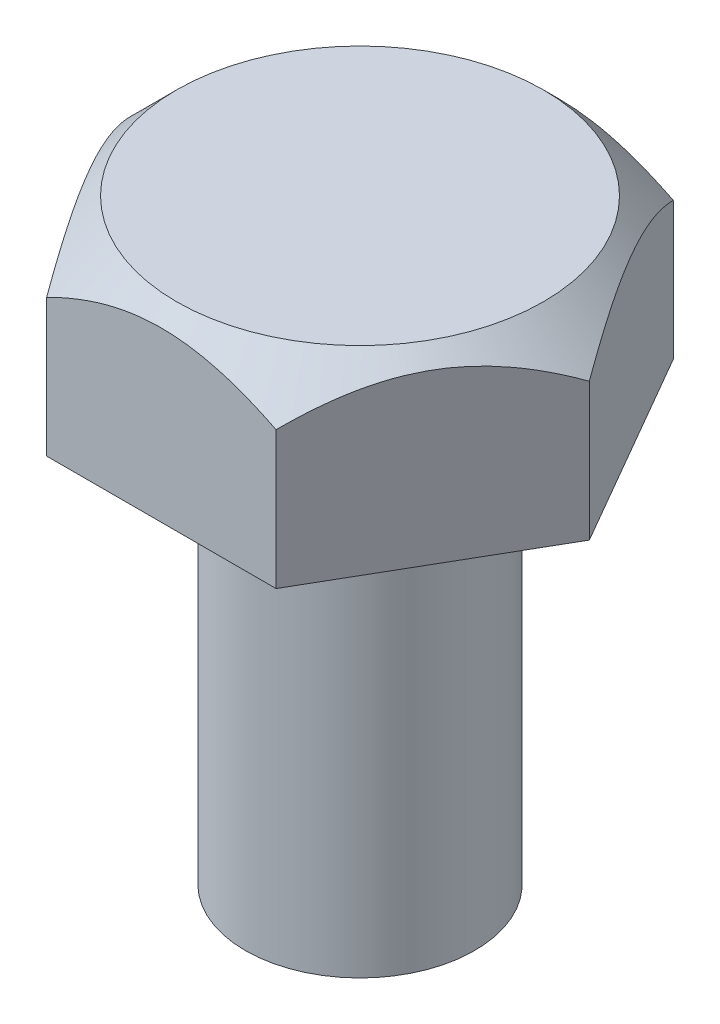
ISO-10303-21;
HEADER;
FILE_DESCRIPTION(('STEP AP214'),'2;1');
FILE_NAME('part.step','',(''),(''),'','','');
FILE_SCHEMA(('AUTOMOTIVE_DESIGN { 1 0 10303 214 1 1 1 1 }'));
ENDSEC;
DATA;
#1=APPLICATION_CONTEXT('core data for automotive mechanical design processes');
#2=APPLICATION_PROTOCOL_DEFINITION('international standard','automotive_design',2000,#1);
#3=PRODUCT_CONTEXT('',#1,'mechanical');
#4=PRODUCT('Part','Part','',(#3));
#5=PRODUCT_RELATED_PRODUCT_CATEGORY('part','',(#4));
#6=PRODUCT_DEFINITION_FORMATION('','',#4);
#7=PRODUCT_DEFINITION_CONTEXT('part definition',#1,'design');
#8=PRODUCT_DEFINITION('design','',#6,#7);
#9=PRODUCT_DEFINITION_SHAPE('','',#8);
#10=(LENGTH_UNIT() NAMED_UNIT(*) SI_UNIT(.MILLI.,.METRE.));
#11=(NAMED_UNIT(*) PLANE_ANGLE_UNIT() SI_UNIT($,.RADIAN.));
#12=(NAMED_UNIT(*) SI_UNIT($,.STERADIAN.) SOLID_ANGLE_UNIT());
#13=UNCERTAINTY_MEASURE_WITH_UNIT(LENGTH_MEASURE(1.E-05),#10,'distance_accuracy_value','');
#14=(GEOMETRIC_REPRESENTATION_CONTEXT(3) GLOBAL_UNCERTAINTY_ASSIGNED_CONTEXT((#13)) GLOBAL_UNIT_ASSIGNED_CONTEXT((#10,
#11,#12)) REPRESENTATION_CONTEXT('',''));
#15=CARTESIAN_POINT('',(0.,0.,0.));
#16=DIRECTION('',(0.,0.,1.));
#17=DIRECTION('',(1.,0.,0.));
#18=AXIS2_PLACEMENT_3D('',#15,#16,#17);
#19=CARTESIAN_POINT('',(0.,9.,0.));
#20=DIRECTION('',(0.,-1.,0.));
#21=DIRECTION('',(0.,0.,-1.));
#22=AXIS2_PLACEMENT_3D('',#19,#20,#21);
#23=CYLINDRICAL_SURFACE('',#22,2.5);
#24=CARTESIAN_POINT('',(0.,9.,0.));
#25=DIRECTION('',(0.,1.,0.));
#26=DIRECTION('',(0.,0.,1.));
#27=AXIS2_PLACEMENT_3D('',#24,#25,#26);
#28=CIRCLE('',#27,2.5);
#29=CARTESIAN_POINT('',(0.,9.,2.5));
#30=VERTEX_POINT('',#29);
#31=EDGE_CURVE('E11',#30,#30,#28,.T.);
#32=ORIENTED_EDGE('',*,*,#31,.F.);
#33=EDGE_LOOP('',(#32));
#34=FACE_BOUND('',#33,.T.);
#35=CARTESIAN_POINT('',(0.,0.,0.));
#36=DIRECTION('',(0.,1.,0.));
#37=DIRECTION('',(0.,0.,1.));
#38=AXIS2_PLACEMENT_3D('',#35,#36,#37);
#39=CIRCLE('',#38,2.5);
#40=CARTESIAN_POINT('',(0.,0.,2.5));
#41=VERTEX_POINT('',#40);
#42=EDGE_CURVE('E45',#41,#41,#39,.T.);
#43=ORIENTED_EDGE('',*,*,#42,.T.);
#44=EDGE_LOOP('',(#43));
#45=FACE_BOUND('',#44,.T.);
#46=ADVANCED_FACE('F39',(#34,#45),#23,.T.);
#47=CARTESIAN_POINT('',(0.,0.,0.));
#48=DIRECTION('',(0.,1.,0.));
#49=DIRECTION('',(0.,0.,1.));
#50=AXIS2_PLACEMENT_3D('',#47,#48,#49);
#51=PLANE('',#50);
#52=ORIENTED_EDGE('',*,*,#42,.F.);
#53=EDGE_LOOP('',(#52));
#54=FACE_BOUND('',#53,.T.);
#55=ADVANCED_FACE('F128',(#54),#51,.F.);
#56=CARTESIAN_POINT('',(-5.,13.,0.));
#57=DIRECTION('',(0.866025403784439,0.,-0.5));
#58=DIRECTION('',(-0.5,0.,-0.866025403784439));
#59=AXIS2_PLACEMENT_3D('',#56,#57,#58);
#60=PLANE('',#59);
#61=DIRECTION('',(0.,-1.,0.));
#62=VECTOR('',#61,1.);
#63=CARTESIAN_POINT('',(-2.5,13.,4.33012701892219));
#64=LINE('',#63,#62);
#65=CARTESIAN_POINT('',(-2.5,12.,4.33012701892219));
#66=VERTEX_POINT('',#65);
#67=CARTESIAN_POINT('',(-2.5,9.,4.33012701892219));
#68=VERTEX_POINT('',#67);
#69=EDGE_CURVE('E118',#66,#68,#64,.T.);
#70=ORIENTED_EDGE('',*,*,#69,.F.);
#71=CARTESIAN_POINT('',(-2.49988452994616,11.9998845259463,4.33032701892219));
#72=CARTESIAN_POINT('',(-2.54287138041576,12.0428679014172,4.25587160985149));
#73=CARTESIAN_POINT('',(-2.58618865330985,12.0845322160249,4.18084389235359));
#74=CARTESIAN_POINT('',(-2.67354887274435,12.1648214570814,4.02953155373268));
#75=CARTESIAN_POINT('',(-2.71759219997896,12.2034447234691,3.95324627322795));
#76=CARTESIAN_POINT('',(-2.85131771209198,12.3144804420678,3.72162689198003));
#77=CARTESIAN_POINT('',(-2.94213197757914,12.3815850955109,3.56433197010422));
#78=CARTESIAN_POINT('',(-3.12526622915858,12.4964973477853,3.24713414176253));
#79=CARTESIAN_POINT('',(-3.21753940303059,12.5445944631137,3.08731231644057));
#80=CARTESIAN_POINT('',(-3.35746623690526,12.6002311247179,2.8449519308274));
#81=CARTESIAN_POINT('',(-3.40431453249364,12.616017735568,2.76380830262032));
#82=CARTESIAN_POINT('',(-3.4984078137364,12.6417307019677,2.60083395885699));
#83=CARTESIAN_POINT('',(-3.54565273902892,12.6516579334098,2.51900334785054));
#84=CARTESIAN_POINT('',(-3.66078037944806,12.6683021731439,2.31959642528907));
#85=CARTESIAN_POINT('',(-3.72878713668329,12.6717946588034,2.20180526649966));
#86=CARTESIAN_POINT('',(-3.86467809794897,12.6659341038672,1.96643521729813));
#87=CARTESIAN_POINT('',(-3.93256225066694,12.6565765602643,1.84885641576183));
#88=CARTESIAN_POINT('',(-4.06769057590285,12.6255675384182,1.61480729091154));
#89=CARTESIAN_POINT('',(-4.13493394699394,12.6039023105296,1.49833835570958));
#90=CARTESIAN_POINT('',(-4.26826494691756,12.5494557859257,1.26740228961789));
#91=CARTESIAN_POINT('',(-4.33435266395686,12.516675341522,1.1529350059496));
#92=CARTESIAN_POINT('',(-4.45167355371377,12.4492338613143,0.949729264101439));
#93=CARTESIAN_POINT('',(-4.5031664451357,12.4163460937711,0.860540959930036));
#94=CARTESIAN_POINT('',(-4.60522781060437,12.3452704801556,0.683765489448429));
#95=CARTESIAN_POINT('',(-4.65579625649568,12.3070824729595,0.596178371904883));
#96=CARTESIAN_POINT('',(-4.75584946376349,12.226262498628,0.422881133456828));
#97=CARTESIAN_POINT('',(-4.80533707077893,12.1836445061233,0.337166083761075));
#98=CARTESIAN_POINT('',(-4.90339584958638,12.0945241637333,0.16732329673841));
#99=CARTESIAN_POINT('',(-4.95196756146993,12.048024196775,0.0831946239455099));
#100=CARTESIAN_POINT('',(-5.00011547005384,11.9998845259463,-0.000199999999998267));
#101=B_SPLINE_CURVE_WITH_KNOTS('',3,(#71,#72,#73,#74,#75,#76,#77,#78,#79,#80,#81,#82,#83,#84,
#85,#86,#87,#88,#89,#90,#91,#92,#93,#94,#95,#96,#97,#98,#99,#100),.UNSPECIFIED.,.F.,.F.,(4,2,2,
2,2,2,2,2,2,2,2,2,2,2,4),(0.,0.288343025050063,0.576842376266667,1.15695604992332,
1.72785747296512,2.01274823950903,2.29759640821263,2.70513724110404,3.11282092407139,
3.52096095288677,3.92906969271704,4.25324617843569,4.57743252106522,4.90062556888121,
5.22362166510138),.UNSPECIFIED.);
#102=CARTESIAN_POINT('',(-5.,12.,0.));
#103=VERTEX_POINT('',#102);
#104=EDGE_CURVE('E148',#66,#103,#101,.T.);
#105=ORIENTED_EDGE('',*,*,#104,.T.);
#106=DIRECTION('',(0.,-1.,0.));
#107=VECTOR('',#106,1.);
#108=CARTESIAN_POINT('',(-5.,13.,0.));
#109=LINE('',#108,#107);
#110=CARTESIAN_POINT('',(-5.,9.,0.));
#111=VERTEX_POINT('',#110);
#112=EDGE_CURVE('E62',#103,#111,#109,.T.);
#113=ORIENTED_EDGE('',*,*,#112,.T.);
#114=DIRECTION('',(0.5,0.,0.866025403784439));
#115=VECTOR('',#114,1.);
#116=CARTESIAN_POINT('',(-5.,9.,0.));
#117=LINE('',#116,#115);
#118=EDGE_CURVE('E152',#111,#68,#117,.T.);
#119=ORIENTED_EDGE('',*,*,#118,.T.);
#120=EDGE_LOOP('',(#70,#105,#113,#119));
#121=FACE_BOUND('',#120,.T.);
#122=ADVANCED_FACE('F135',(#121),#60,.F.);
#123=CARTESIAN_POINT('',(-2.5,13.,4.33012701892219));
#124=DIRECTION('',(0.,0.,-1.));
#125=DIRECTION('',(-1.,0.,0.));
#126=AXIS2_PLACEMENT_3D('',#123,#124,#125);
#127=PLANE('',#126);
#128=DIRECTION('',(0.,-1.,0.));
#129=VECTOR('',#128,1.);
#130=CARTESIAN_POINT('',(2.5,13.,4.33012701892219));
#131=LINE('',#130,#129);
#132=CARTESIAN_POINT('',(2.5,12.,4.33012701892219));
#133=VERTEX_POINT('',#132);
#134=CARTESIAN_POINT('',(2.5,9.,4.33012701892219));
#135=VERTEX_POINT('',#134);
#136=EDGE_CURVE('E111',#133,#135,#131,.T.);
#137=ORIENTED_EDGE('',*,*,#136,.F.);
#138=CARTESIAN_POINT('',(7.59921951359279,8.25367864666697,4.3301270189222));
#139=CARTESIAN_POINT('',(7.48699247756582,8.35118426563294,4.3301270189222));
#140=CARTESIAN_POINT('',(7.37450605913897,8.44839137505781,4.3301270189222));
#141=CARTESIAN_POINT('',(7.14894544849833,8.64212478615553,4.3301270189222));
#142=CARTESIAN_POINT('',(7.03587124679441,8.73865107677647,4.3301270189222));
#143=CARTESIAN_POINT('',(6.69556519020094,9.02716624616905,4.3301270189222));
#144=CARTESIAN_POINT('',(6.46735241242823,9.21800207958195,4.3301270189222));
#145=CARTESIAN_POINT('',(6.00244910758804,9.59990517797512,4.3301270189222));
#146=CARTESIAN_POINT('',(5.76568333547581,9.79088117220917,4.3301270189222));
#147=CARTESIAN_POINT('',(5.28773027314545,10.1671121203224,4.3301270189222));
#148=CARTESIAN_POINT('',(5.04654410187623,10.3523684910034,4.33012701892219));
#149=CARTESIAN_POINT('',(4.55795427576486,10.7152539731287,4.33012701892219));
#150=CARTESIAN_POINT('',(4.31054304061882,10.8928729934364,4.33012701892219));
#151=CARTESIAN_POINT('',(3.93341818828449,11.1507750381669,4.33012701892219));
#152=CARTESIAN_POINT('',(3.80664733518685,11.2353592003148,4.33012701892219));
#153=CARTESIAN_POINT('',(3.55082533863258,11.4009968353064,4.33012701892219));
#154=CARTESIAN_POINT('',(3.42177439311459,11.4820506125323,4.33012701892219));
#155=CARTESIAN_POINT('',(3.16199806432158,11.639251894182,4.33012701892219));
#156=CARTESIAN_POINT('',(3.03129190461664,11.7154310235148,4.33012701892219));
#157=CARTESIAN_POINT('',(2.7669085874914,11.8625188449221,4.33012701892219));
#158=CARTESIAN_POINT('',(2.63323107423656,11.9334269012938,4.33012701892219));
#159=CARTESIAN_POINT('',(2.36276633080915,12.0685737969327,4.33012701892219));
#160=CARTESIAN_POINT('',(2.22598396638433,12.1328222970525,4.33012701892219));
#161=CARTESIAN_POINT('',(1.94889793365953,12.2531442688083,4.33012701892219));
#162=CARTESIAN_POINT('',(1.80859565104085,12.3092209000482,4.33012701892219));
#163=CARTESIAN_POINT('',(1.5210910162557,12.4124815838396,4.33012701892219));
#164=CARTESIAN_POINT('',(1.37380428933833,12.459434008593,4.33012701892219));
#165=CARTESIAN_POINT('',(1.07571750853243,12.5405572677146,4.33012701892219));
#166=CARTESIAN_POINT('',(0.924918018453904,12.5747301384307,4.33012701892219));
#167=CARTESIAN_POINT('',(0.621622317866135,12.6280097359017,4.33012701892219));
#168=CARTESIAN_POINT('',(0.469143126259013,12.6472114182584,4.33012701892219));
#169=CARTESIAN_POINT('',(0.16300220939947,12.6694938314688,4.33012701892219));
#170=CARTESIAN_POINT('',(0.00934062284925808,12.6725764251674,4.33012701892219));
#171=CARTESIAN_POINT('',(-0.297696033322761,12.6623702719493,4.33012701892219));
#172=CARTESIAN_POINT('',(-0.451070124483317,12.6490527373931,4.33012701892219));
#173=CARTESIAN_POINT('',(-0.755678508307854,12.6070212422452,4.33012701892219));
#174=CARTESIAN_POINT('',(-0.906912363013274,12.5783041758869,4.33012701892219));
#175=CARTESIAN_POINT('',(-1.2072112884746,12.5071281237141,4.33012701892219));
#176=CARTESIAN_POINT('',(-1.35625267713972,12.4645709903875,4.33012701892219));
#177=CARTESIAN_POINT('',(-1.65053794073623,12.3680526231404,4.33012701892219));
#178=CARTESIAN_POINT('',(-1.79578174526941,12.3140911779791,4.33012701892219));
#179=CARTESIAN_POINT('',(-2.11307073215611,12.1844175150299,4.33012701892219));
#180=CARTESIAN_POINT('',(-2.28421549179871,12.1065212639994,4.33012701892219));
#181=CARTESIAN_POINT('',(-2.62142059572484,11.9403251951652,4.33012701892219));
#182=CARTESIAN_POINT('',(-2.78747795627213,11.8520194140099,4.33012701892219));
#183=CARTESIAN_POINT('',(-3.11543948043553,11.6673110360987,4.33012701892219));
#184=CARTESIAN_POINT('',(-3.2773344050716,11.570892168673,4.33012701892219));
#185=CARTESIAN_POINT('',(-3.59727339089177,11.3719729247574,4.33012701892219));
#186=CARTESIAN_POINT('',(-3.75531820223985,11.2694737465554,4.33012701892219));
#187=CARTESIAN_POINT('',(-4.06905173475919,11.0591610978369,4.33012701892219));
#188=CARTESIAN_POINT('',(-4.22472317767924,10.9513219741767,4.33012701892219));
#189=CARTESIAN_POINT('',(-4.53336890520681,10.7318530724426,4.33012701892219));
#190=CARTESIAN_POINT('',(-4.68634309311015,10.6202231588763,4.33012701892219));
#191=CARTESIAN_POINT('',(-4.98984972858032,10.3940651748505,4.33012701892219));
#192=CARTESIAN_POINT('',(-5.14038482040812,10.2795406432409,4.33012701892219));
#193=CARTESIAN_POINT('',(-5.43955784308425,10.0480350376165,4.33012701892219));
#194=CARTESIAN_POINT('',(-5.58819571102979,9.93105388249031,4.33012701892219));
#195=CARTESIAN_POINT('',(-5.89518635745014,9.68603900594882,4.33012701892219));
#196=CARTESIAN_POINT('',(-6.05341108869283,9.55784508755712,4.33012701892219));
#197=CARTESIAN_POINT('',(-6.3682912521162,9.29954321420477,4.33012701892219));
#198=CARTESIAN_POINT('',(-6.52494666451841,9.16943523517165,4.33012701892219));
#199=CARTESIAN_POINT('',(-6.83518118684618,8.90910077400727,4.33012701892219));
#200=CARTESIAN_POINT('',(-6.98877510446431,8.77889191202406,4.33012701892219));
#201=CARTESIAN_POINT('',(-7.29480873067968,8.51719336283558,4.33012701892219));
#202=CARTESIAN_POINT('',(-7.4472486907282,8.38570396982764,4.33012701892219));
#203=CARTESIAN_POINT('',(-7.59921951359279,8.25367864666697,4.33012701892219));
#204=B_SPLINE_CURVE_WITH_KNOTS('',3,(#138,#139,#140,#141,#142,#143,#144,#145,#146,#147,#148,
#149,#150,#151,#152,#153,#154,#155,#156,#157,#158,#159,#160,#161,#162,#163,#164,#165,#166,#167,
#168,#169,#170,#171,#172,#173,#174,#175,#176,#177,#178,#179,#180,#181,#182,#183,#184,#185,#186,
#187,#188,#189,#190,#191,#192,#193,#194,#195,#196,#197,#198,#199,#200,#201,#202,#203),
.UNSPECIFIED.,.F.,.F.,(4,2,2,2,2,2,2,2,2,2,2,2,2,2,2,2,2,2,2,2,2,2,2,2,2,2,2,2,2,2,2,2,4),(0.,
0.446003957696259,0.892015138902988,1.78444545205319,2.6969412715932,3.60920921409759,
4.52264764303546,4.97979846611419,5.43690979628029,5.89066842739224,6.34448169430946,
6.79762713021695,7.25059689265077,7.71388352952139,8.17709631285966,8.63734668751579,
9.09754387095326,9.55855000507355,10.0196491495724,10.4840922330261,10.9485439200596,
11.5121821150824,12.0761447876206,12.6412667411846,13.2062776900007,13.7743322928723,
14.3424072208553,14.9098183649612,15.4772482730702,16.0881462572516,16.6990519310606,
17.303121069493,17.9070545540327),.UNSPECIFIED.);
#205=EDGE_CURVE('E154',#133,#66,#204,.T.);
#206=ORIENTED_EDGE('',*,*,#205,.T.);
#207=ORIENTED_EDGE('',*,*,#69,.T.);
#208=DIRECTION('',(1.,0.,0.));
#209=VECTOR('',#208,1.);
#210=CARTESIAN_POINT('',(-2.5,9.,4.33012701892219));
#211=LINE('',#210,#209);
#212=EDGE_CURVE('E216',#68,#135,#211,.T.);
#213=ORIENTED_EDGE('',*,*,#212,.T.);
#214=EDGE_LOOP('',(#137,#206,#207,#213));
#215=FACE_BOUND('',#214,.T.);
#216=ADVANCED_FACE('F139',(#215),#127,.F.);
#217=CARTESIAN_POINT('',(2.5,13.,4.33012701892219));
#218=DIRECTION('',(-0.866025403784439,0.,-0.499999999999999));
#219=DIRECTION('',(-0.5,0.,0.866025403784439));
#220=AXIS2_PLACEMENT_3D('',#217,#218,#219);
#221=PLANE('',#220);
#222=DIRECTION('',(0.,-1.,0.));
#223=VECTOR('',#222,1.);
#224=CARTESIAN_POINT('',(5.,13.,0.));
#225=LINE('',#224,#223);
#226=CARTESIAN_POINT('',(5.,12.,0.));
#227=VERTEX_POINT('',#226);
#228=CARTESIAN_POINT('',(5.,9.,0.));
#229=VERTEX_POINT('',#228);
#230=EDGE_CURVE('E115',#227,#229,#225,.T.);
#231=ORIENTED_EDGE('',*,*,#230,.F.);
#232=CARTESIAN_POINT('',(5.00011547005384,11.9998845259463,-0.000200000000002783));
#233=CARTESIAN_POINT('',(4.95712861958424,12.0428679014172,0.0742554090707027));
#234=CARTESIAN_POINT('',(4.91381134669015,12.0845322160249,0.1492831265686));
#235=CARTESIAN_POINT('',(4.82645112725565,12.1648214570814,0.300595465189509));
#236=CARTESIAN_POINT('',(4.78240780002104,12.2034447234691,0.376880745694237));
#237=CARTESIAN_POINT('',(4.64868228790802,12.3144804420678,0.608500126942161));
#238=CARTESIAN_POINT('',(4.55786802242086,12.3815850955109,0.765795048817972));
#239=CARTESIAN_POINT('',(4.37473377084142,12.4964973477853,1.08299287715966));
#240=CARTESIAN_POINT('',(4.28246059696941,12.5445944631137,1.24281470248163));
#241=CARTESIAN_POINT('',(4.14253376309474,12.6002311247179,1.48517508809479));
#242=CARTESIAN_POINT('',(4.09568546750636,12.616017735568,1.56631871630187));
#243=CARTESIAN_POINT('',(4.0015921862636,12.6417307019677,1.7292930600652));
#244=CARTESIAN_POINT('',(3.95434726097108,12.6516579334098,1.81112367107165));
#245=CARTESIAN_POINT('',(3.83921962055194,12.6683021731439,2.01053059363312));
#246=CARTESIAN_POINT('',(3.77121286331671,12.6717946588034,2.12832175242254));
#247=CARTESIAN_POINT('',(3.63532190205104,12.6659341038672,2.36369180162406));
#248=CARTESIAN_POINT('',(3.56743774933306,12.6565765602643,2.48127060316037));
#249=CARTESIAN_POINT('',(3.43230942409715,12.6255675384182,2.71531972801065));
#250=CARTESIAN_POINT('',(3.36506605300607,12.6039023105296,2.83178866321262));
#251=CARTESIAN_POINT('',(3.23173505308244,12.5494557859257,3.0627247293043));
#252=CARTESIAN_POINT('',(3.16564733604314,12.516675341522,3.17719201297259));
#253=CARTESIAN_POINT('',(3.04832644628623,12.4492338613143,3.38039775482075));
#254=CARTESIAN_POINT('',(2.99683355486431,12.4163460937711,3.46958605899216));
#255=CARTESIAN_POINT('',(2.89477218939563,12.3452704801556,3.64636152947377));
#256=CARTESIAN_POINT('',(2.84420374350432,12.3070824729595,3.73394864701731));
#257=CARTESIAN_POINT('',(2.74415053623651,12.226262498628,3.90724588546537));
#258=CARTESIAN_POINT('',(2.69466292922107,12.1836445061233,3.99296093516112));
#259=CARTESIAN_POINT('',(2.59660415041362,12.0945241637333,4.16280372218379));
#260=CARTESIAN_POINT('',(2.54803243853007,12.048024196775,4.24693239497669));
#261=CARTESIAN_POINT('',(2.49988452994616,11.9998845259463,4.33032701892219));
#262=B_SPLINE_CURVE_WITH_KNOTS('',3,(#232,#233,#234,#235,#236,#237,#238,#239,#240,#241,#242,
#243,#244,#245,#246,#247,#248,#249,#250,#251,#252,#253,#254,#255,#256,#257,#258,#259,#260,#261),
.UNSPECIFIED.,.F.,.F.,(4,2,2,2,2,2,2,2,2,2,2,2,2,2,4),(0.,0.288343025050061,0.576842376266668,
1.15695604992332,1.72785747296512,2.01274823950903,2.29759640821263,2.70513724110404,
3.11282092407139,3.52096095288677,3.92906969271704,4.25324617843569,4.57743252106523,
4.90062556888121,5.22362166510138),.UNSPECIFIED.);
#263=EDGE_CURVE('E94',#227,#133,#262,.T.);
#264=ORIENTED_EDGE('',*,*,#263,.T.);
#265=ORIENTED_EDGE('',*,*,#136,.T.);
#266=DIRECTION('',(0.499999999999999,0.,-0.866025403784439));
#267=VECTOR('',#266,1.);
#268=CARTESIAN_POINT('',(2.5,9.,4.33012701892219));
#269=LINE('',#268,#267);
#270=EDGE_CURVE('E220',#135,#229,#269,.T.);
#271=ORIENTED_EDGE('',*,*,#270,.T.);
#272=EDGE_LOOP('',(#231,#264,#265,#271));
#273=FACE_BOUND('',#272,.T.);
#274=ADVANCED_FACE('F193',(#273),#221,.F.);
#275=CARTESIAN_POINT('',(5.,13.,0.));
#276=DIRECTION('',(-0.866025403784438,0.,0.5));
#277=DIRECTION('',(0.5,0.,0.866025403784439));
#278=AXIS2_PLACEMENT_3D('',#275,#276,#277);
#279=PLANE('',#278);
#280=DIRECTION('',(0.,-1.,0.));
#281=VECTOR('',#280,1.);
#282=CARTESIAN_POINT('',(2.5,13.,-4.3301270189222));
#283=LINE('',#282,#281);
#284=CARTESIAN_POINT('',(2.5,12.,-4.3301270189222));
#285=VERTEX_POINT('',#284);
#286=CARTESIAN_POINT('',(2.5,9.,-4.3301270189222));
#287=VERTEX_POINT('',#286);
#288=EDGE_CURVE('E103',#285,#287,#283,.T.);
#289=ORIENTED_EDGE('',*,*,#288,.F.);
#290=CARTESIAN_POINT('',(2.49988452994616,11.9998845259463,-4.33032701892219));
#291=CARTESIAN_POINT('',(2.54287138041576,12.0428679014172,-4.25587160985149));
#292=CARTESIAN_POINT('',(2.58618865330985,12.0845322160249,-4.18084389235359));
#293=CARTESIAN_POINT('',(2.67354887274434,12.1648214570814,-4.02953155373268));
#294=CARTESIAN_POINT('',(2.71759219997895,12.2034447234691,-3.95324627322795));
#295=CARTESIAN_POINT('',(2.85131771209198,12.3144804420678,-3.72162689198003));
#296=CARTESIAN_POINT('',(2.94213197757914,12.3815850955109,-3.56433197010422));
#297=CARTESIAN_POINT('',(3.12526622915858,12.4964973477853,-3.24713414176253));
#298=CARTESIAN_POINT('',(3.21753940303059,12.5445944631137,-3.08731231644056));
#299=CARTESIAN_POINT('',(3.35746623690526,12.6002311247179,-2.8449519308274));
#300=CARTESIAN_POINT('',(3.40431453249364,12.616017735568,-2.76380830262032));
#301=CARTESIAN_POINT('',(3.4984078137364,12.6417307019677,-2.60083395885699));
#302=CARTESIAN_POINT('',(3.54565273902892,12.6516579334098,-2.51900334785054));
#303=CARTESIAN_POINT('',(3.66078037944806,12.6683021731439,-2.31959642528907));
#304=CARTESIAN_POINT('',(3.72878713668329,12.6717946588034,-2.20180526649965));
#305=CARTESIAN_POINT('',(3.86467809794897,12.6659341038672,-1.96643521729813));
#306=CARTESIAN_POINT('',(3.93256225066694,12.6565765602643,-1.84885641576183));
#307=CARTESIAN_POINT('',(4.06769057590285,12.6255675384182,-1.61480729091154));
#308=CARTESIAN_POINT('',(4.13493394699394,12.6039023105296,-1.49833835570957));
#309=CARTESIAN_POINT('',(4.26826494691756,12.5494557859257,-1.26740228961789));
#310=CARTESIAN_POINT('',(4.33435266395686,12.516675341522,-1.1529350059496));
#311=CARTESIAN_POINT('',(4.45167355371377,12.4492338613143,-0.949729264101437));
#312=CARTESIAN_POINT('',(4.5031664451357,12.4163460937711,-0.860540959930033));
#313=CARTESIAN_POINT('',(4.60522781060437,12.3452704801556,-0.683765489448426));
#314=CARTESIAN_POINT('',(4.65579625649568,12.3070824729595,-0.596178371904881));
#315=CARTESIAN_POINT('',(4.75584946376349,12.226262498628,-0.422881133456827));
#316=CARTESIAN_POINT('',(4.80533707077893,12.1836445061233,-0.337166083761075));
#317=CARTESIAN_POINT('',(4.90339584958638,12.0945241637333,-0.16732329673841));
#318=CARTESIAN_POINT('',(4.95196756146993,12.048024196775,-0.0831946239455103));
#319=CARTESIAN_POINT('',(5.00011547005384,11.9998845259463,0.000199999999997984));
#320=B_SPLINE_CURVE_WITH_KNOTS('',3,(#290,#291,#292,#293,#294,#295,#296,#297,#298,#299,#300,
#301,#302,#303,#304,#305,#306,#307,#308,#309,#310,#311,#312,#313,#314,#315,#316,#317,#318,#319),
.UNSPECIFIED.,.F.,.F.,(4,2,2,2,2,2,2,2,2,2,2,2,2,2,4),(0.,0.288343025050063,0.57684237626667,
1.15695604992332,1.72785747296512,2.01274823950903,2.29759640821263,2.70513724110404,
3.11282092407139,3.52096095288678,3.92906969271704,4.25324617843569,4.57743252106523,
4.90062556888121,5.22362166510138),.UNSPECIFIED.);
#321=EDGE_CURVE('E93',#285,#227,#320,.T.);
#322=ORIENTED_EDGE('',*,*,#321,.T.);
#323=ORIENTED_EDGE('',*,*,#230,.T.);
#324=DIRECTION('',(-0.5,0.,-0.866025403784438));
#325=VECTOR('',#324,1.);
#326=CARTESIAN_POINT('',(5.,9.,0.));
#327=LINE('',#326,#325);
#328=EDGE_CURVE('E109',#229,#287,#327,.T.);
#329=ORIENTED_EDGE('',*,*,#328,.T.);
#330=EDGE_LOOP('',(#289,#322,#323,#329));
#331=FACE_BOUND('',#330,.T.);
#332=ADVANCED_FACE('F107',(#331),#279,.F.);
#333=CARTESIAN_POINT('',(2.5,13.,-4.3301270189222));
#334=DIRECTION('',(0.,0.,1.));
#335=DIRECTION('',(1.,0.,0.));
#336=AXIS2_PLACEMENT_3D('',#333,#334,#335);
#337=PLANE('',#336);
#338=DIRECTION('',(0.,-1.,0.));
#339=VECTOR('',#338,1.);
#340=CARTESIAN_POINT('',(-2.5,13.,-4.3301270189222));
#341=LINE('',#340,#339);
#342=CARTESIAN_POINT('',(-2.5,12.,-4.3301270189222));
#343=VERTEX_POINT('',#342);
#344=CARTESIAN_POINT('',(-2.5,9.,-4.3301270189222));
#345=VERTEX_POINT('',#344);
#346=EDGE_CURVE('E104',#343,#345,#341,.T.);
#347=ORIENTED_EDGE('',*,*,#346,.F.);
#348=CARTESIAN_POINT('',(-7.59921951359278,8.25367864666697,-4.3301270189222));
#349=CARTESIAN_POINT('',(-7.48699247756582,8.35118426563294,-4.3301270189222));
#350=CARTESIAN_POINT('',(-7.37450605913897,8.44839137505781,-4.3301270189222));
#351=CARTESIAN_POINT('',(-7.14894544849832,8.64212478615553,-4.3301270189222));
#352=CARTESIAN_POINT('',(-7.03587124679441,8.73865107677647,-4.3301270189222));
#353=CARTESIAN_POINT('',(-6.69556519020093,9.02716624616905,-4.3301270189222));
#354=CARTESIAN_POINT('',(-6.46735241242823,9.21800207958195,-4.3301270189222));
#355=CARTESIAN_POINT('',(-6.00244910758804,9.59990517797512,-4.3301270189222));
#356=CARTESIAN_POINT('',(-5.76568333547581,9.79088117220917,-4.3301270189222));
#357=CARTESIAN_POINT('',(-5.28773027314545,10.1671121203224,-4.3301270189222));
#358=CARTESIAN_POINT('',(-5.04654410187623,10.3523684910034,-4.3301270189222));
#359=CARTESIAN_POINT('',(-4.55795427576486,10.7152539731287,-4.3301270189222));
#360=CARTESIAN_POINT('',(-4.31054304061881,10.8928729934364,-4.3301270189222));
#361=CARTESIAN_POINT('',(-3.93341818828448,11.1507750381669,-4.3301270189222));
#362=CARTESIAN_POINT('',(-3.80664733518685,11.2353592003148,-4.3301270189222));
#363=CARTESIAN_POINT('',(-3.55082533863257,11.4009968353064,-4.3301270189222));
#364=CARTESIAN_POINT('',(-3.42177439311458,11.4820506125323,-4.3301270189222));
#365=CARTESIAN_POINT('',(-3.16199806432158,11.639251894182,-4.3301270189222));
#366=CARTESIAN_POINT('',(-3.03129190461664,11.7154310235148,-4.3301270189222));
#367=CARTESIAN_POINT('',(-2.7669085874914,11.8625188449221,-4.3301270189222));
#368=CARTESIAN_POINT('',(-2.63323107423655,11.9334269012938,-4.3301270189222));
#369=CARTESIAN_POINT('',(-2.36276633080915,12.0685737969327,-4.3301270189222));
#370=CARTESIAN_POINT('',(-2.22598396638432,12.1328222970525,-4.3301270189222));
#371=CARTESIAN_POINT('',(-1.94889793365953,12.2531442688083,-4.3301270189222));
#372=CARTESIAN_POINT('',(-1.80859565104085,12.3092209000482,-4.3301270189222));
#373=CARTESIAN_POINT('',(-1.5210910162557,12.4124815838396,-4.3301270189222));
#374=CARTESIAN_POINT('',(-1.37380428933832,12.459434008593,-4.3301270189222));
#375=CARTESIAN_POINT('',(-1.07571750853243,12.5405572677146,-4.3301270189222));
#376=CARTESIAN_POINT('',(-0.924918018453902,12.5747301384307,-4.3301270189222));
#377=CARTESIAN_POINT('',(-0.621622317866133,12.6280097359017,-4.3301270189222));
#378=CARTESIAN_POINT('',(-0.469143126259011,12.6472114182584,-4.3301270189222));
#379=CARTESIAN_POINT('',(-0.163002209399467,12.6694938314688,-4.3301270189222));
#380=CARTESIAN_POINT('',(-0.00934062284925466,12.6725764251674,-4.3301270189222));
#381=CARTESIAN_POINT('',(0.297696033322765,12.6623702719493,-4.3301270189222));
#382=CARTESIAN_POINT('',(0.451070124483322,12.6490527373931,-4.3301270189222));
#383=CARTESIAN_POINT('',(0.755678508307859,12.6070212422452,-4.3301270189222));
#384=CARTESIAN_POINT('',(0.906912363013278,12.5783041758869,-4.3301270189222));
#385=CARTESIAN_POINT('',(1.20721128847461,12.5071281237141,-4.3301270189222));
#386=CARTESIAN_POINT('',(1.35625267713972,12.4645709903875,-4.3301270189222));
#387=CARTESIAN_POINT('',(1.65053794073623,12.3680526231404,-4.3301270189222));
#388=CARTESIAN_POINT('',(1.79578174526941,12.3140911779791,-4.3301270189222));
#389=CARTESIAN_POINT('',(2.11307073215612,12.1844175150299,-4.3301270189222));
#390=CARTESIAN_POINT('',(2.28421549179871,12.1065212639994,-4.3301270189222));
#391=CARTESIAN_POINT('',(2.62142059572484,11.9403251951652,-4.3301270189222));
#392=CARTESIAN_POINT('',(2.78747795627214,11.8520194140098,-4.3301270189222));
#393=CARTESIAN_POINT('',(3.11543948043553,11.6673110360987,-4.3301270189222));
#394=CARTESIAN_POINT('',(3.2773344050716,11.570892168673,-4.3301270189222));
#395=CARTESIAN_POINT('',(3.59727339089177,11.3719729247574,-4.3301270189222));
#396=CARTESIAN_POINT('',(3.75531820223985,11.2694737465554,-4.3301270189222));
#397=CARTESIAN_POINT('',(4.06905173475919,11.0591610978369,-4.3301270189222));
#398=CARTESIAN_POINT('',(4.22472317767925,10.9513219741767,-4.3301270189222));
#399=CARTESIAN_POINT('',(4.53336890520682,10.7318530724426,-4.3301270189222));
#400=CARTESIAN_POINT('',(4.68634309311016,10.6202231588763,-4.3301270189222));
#401=CARTESIAN_POINT('',(4.98984972858033,10.3940651748504,-4.3301270189222));
#402=CARTESIAN_POINT('',(5.14038482040813,10.2795406432408,-4.3301270189222));
#403=CARTESIAN_POINT('',(5.43955784308426,10.0480350376165,-4.3301270189222));
#404=CARTESIAN_POINT('',(5.58819571102981,9.9310538824903,-4.3301270189222));
#405=CARTESIAN_POINT('',(5.89518635745016,9.68603900594881,-4.3301270189222));
#406=CARTESIAN_POINT('',(6.05341108869284,9.55784508755711,-4.3301270189222));
#407=CARTESIAN_POINT('',(6.36829125211621,9.29954321420476,-4.3301270189222));
#408=CARTESIAN_POINT('',(6.52494666451841,9.16943523517164,-4.3301270189222));
#409=CARTESIAN_POINT('',(6.83518118684619,8.90910077400727,-4.3301270189222));
#410=CARTESIAN_POINT('',(6.98877510446432,8.77889191202406,-4.3301270189222));
#411=CARTESIAN_POINT('',(7.29480873067968,8.51719336283559,-4.3301270189222));
#412=CARTESIAN_POINT('',(7.4472486907282,8.38570396982765,-4.3301270189222));
#413=CARTESIAN_POINT('',(7.59921951359278,8.25367864666697,-4.3301270189222));
#414=B_SPLINE_CURVE_WITH_KNOTS('',3,(#348,#349,#350,#351,#352,#353,#354,#355,#356,#357,#358,
#359,#360,#361,#362,#363,#364,#365,#366,#367,#368,#369,#370,#371,#372,#373,#374,#375,#376,#377,
#378,#379,#380,#381,#382,#383,#384,#385,#386,#387,#388,#389,#390,#391,#392,#393,#394,#395,#396,
#397,#398,#399,#400,#401,#402,#403,#404,#405,#406,#407,#408,#409,#410,#411,#412,#413),
.UNSPECIFIED.,.F.,.F.,(4,2,2,2,2,2,2,2,2,2,2,2,2,2,2,2,2,2,2,2,2,2,2,2,2,2,2,2,2,2,2,2,4),(0.,
0.446003957696259,0.892015138902988,1.78444545205319,2.6969412715932,3.60920921409759,
4.52264764303546,4.97979846611419,5.43690979628029,5.89066842739224,6.34448169430946,
6.79762713021694,7.25059689265077,7.71388352952139,8.17709631285965,8.63734668751579,
9.09754387095326,9.55855000507355,10.0196491495724,10.4840922330261,10.9485439200596,
11.5121821150824,12.0761447876206,12.6412667411846,13.2062776900007,13.7743322928723,
14.3424072208553,14.9098183649612,15.4772482730702,16.0881462572516,16.6990519310606,
17.303121069493,17.9070545540327),.UNSPECIFIED.);
#415=EDGE_CURVE('E52',#343,#285,#414,.T.);
#416=ORIENTED_EDGE('',*,*,#415,.T.);
#417=ORIENTED_EDGE('',*,*,#288,.T.);
#418=DIRECTION('',(-1.,0.,0.));
#419=VECTOR('',#418,1.);
#420=CARTESIAN_POINT('',(2.5,9.,-4.3301270189222));
#421=LINE('',#420,#419);
#422=EDGE_CURVE('E224',#287,#345,#421,.T.);
#423=ORIENTED_EDGE('',*,*,#422,.T.);
#424=EDGE_LOOP('',(#347,#416,#417,#423));
#425=FACE_BOUND('',#424,.T.);
#426=ADVANCED_FACE('F101',(#425),#337,.F.);
#427=CARTESIAN_POINT('',(-2.5,13.,-4.3301270189222));
#428=DIRECTION('',(0.866025403784439,0.,0.5));
#429=DIRECTION('',(0.5,0.,-0.866025403784439));
#430=AXIS2_PLACEMENT_3D('',#427,#428,#429);
#431=PLANE('',#430);
#432=ORIENTED_EDGE('',*,*,#112,.F.);
#433=CARTESIAN_POINT('',(-5.00011547005384,11.9998845259463,0.000200000000001087));
#434=CARTESIAN_POINT('',(-4.95712861958424,12.0428679014172,-0.0742554090707044));
#435=CARTESIAN_POINT('',(-4.91381134669015,12.0845322160249,-0.149283126568602));
#436=CARTESIAN_POINT('',(-4.82645112725566,12.1648214570814,-0.300595465189511));
#437=CARTESIAN_POINT('',(-4.78240780002105,12.2034447234691,-0.376880745694238));
#438=CARTESIAN_POINT('',(-4.64868228790802,12.3144804420678,-0.608500126942162));
#439=CARTESIAN_POINT('',(-4.55786802242086,12.3815850955109,-0.765795048817973));
#440=CARTESIAN_POINT('',(-4.37473377084142,12.4964973477853,-1.08299287715966));
#441=CARTESIAN_POINT('',(-4.28246059696941,12.5445944631137,-1.24281470248163));
#442=CARTESIAN_POINT('',(-4.14253376309475,12.6002311247179,-1.48517508809479));
#443=CARTESIAN_POINT('',(-4.09568546750636,12.616017735568,-1.56631871630187));
#444=CARTESIAN_POINT('',(-4.0015921862636,12.6417307019677,-1.7292930600652));
#445=CARTESIAN_POINT('',(-3.95434726097108,12.6516579334098,-1.81112367107166));
#446=CARTESIAN_POINT('',(-3.83921962055194,12.6683021731439,-2.01053059363312));
#447=CARTESIAN_POINT('',(-3.77121286331671,12.6717946588034,-2.12832175242254));
#448=CARTESIAN_POINT('',(-3.63532190205104,12.6659341038672,-2.36369180162407));
#449=CARTESIAN_POINT('',(-3.56743774933306,12.6565765602643,-2.48127060316037));
#450=CARTESIAN_POINT('',(-3.43230942409715,12.6255675384182,-2.71531972801065));
#451=CARTESIAN_POINT('',(-3.36506605300607,12.6039023105296,-2.83178866321262));
#452=CARTESIAN_POINT('',(-3.23173505308244,12.5494557859257,-3.0627247293043));
#453=CARTESIAN_POINT('',(-3.16564733604314,12.516675341522,-3.1771920129726));
#454=CARTESIAN_POINT('',(-3.04832644628623,12.4492338613143,-3.38039775482076));
#455=CARTESIAN_POINT('',(-2.99683355486431,12.4163460937711,-3.46958605899216));
#456=CARTESIAN_POINT('',(-2.89477218939563,12.3452704801556,-3.64636152947377));
#457=CARTESIAN_POINT('',(-2.84420374350432,12.3070824729595,-3.73394864701731));
#458=CARTESIAN_POINT('',(-2.74415053623651,12.2262624986279,-3.90724588546537));
#459=CARTESIAN_POINT('',(-2.69466292922107,12.1836445061233,-3.99296093516112));
#460=CARTESIAN_POINT('',(-2.59660415041362,12.0945241637333,-4.16280372218379));
#461=CARTESIAN_POINT('',(-2.54803243853007,12.048024196775,-4.24693239497669));
#462=CARTESIAN_POINT('',(-2.49988452994616,11.9998845259463,-4.3303270189222));
#463=B_SPLINE_CURVE_WITH_KNOTS('',3,(#433,#434,#435,#436,#437,#438,#439,#440,#441,#442,#443,
#444,#445,#446,#447,#448,#449,#450,#451,#452,#453,#454,#455,#456,#457,#458,#459,#460,#461,#462),
.UNSPECIFIED.,.F.,.F.,(4,2,2,2,2,2,2,2,2,2,2,2,2,2,4),(0.,0.288343025050064,0.576842376266668,
1.15695604992332,1.72785747296512,2.01274823950903,2.29759640821263,2.70513724110404,
3.11282092407139,3.52096095288678,3.92906969271704,4.25324617843569,4.57743252106523,
4.90062556888121,5.22362166510138),.UNSPECIFIED.);
#464=EDGE_CURVE('E106',#103,#343,#463,.T.);
#465=ORIENTED_EDGE('',*,*,#464,.T.);
#466=ORIENTED_EDGE('',*,*,#346,.T.);
#467=DIRECTION('',(-0.5,0.,0.866025403784439));
#468=VECTOR('',#467,1.);
#469=CARTESIAN_POINT('',(-2.5,9.,-4.3301270189222));
#470=LINE('',#469,#468);
#471=EDGE_CURVE('E212',#345,#111,#470,.T.);
#472=ORIENTED_EDGE('',*,*,#471,.T.);
#473=EDGE_LOOP('',(#432,#465,#466,#472));
#474=FACE_BOUND('',#473,.T.);
#475=ADVANCED_FACE('F201',(#474),#431,.F.);
#476=CARTESIAN_POINT('',(0.,9.,0.));
#477=DIRECTION('',(0.,1.,0.));
#478=DIRECTION('',(0.,0.,1.));
#479=AXIS2_PLACEMENT_3D('',#476,#477,#478);
#480=PLANE('',#479);
#481=ORIENTED_EDGE('',*,*,#31,.T.);
#482=EDGE_LOOP('',(#481));
#483=FACE_BOUND('',#482,.T.);
#484=ORIENTED_EDGE('',*,*,#118,.F.);
#485=ORIENTED_EDGE('',*,*,#471,.F.);
#486=ORIENTED_EDGE('',*,*,#422,.F.);
#487=ORIENTED_EDGE('',*,*,#328,.F.);
#488=ORIENTED_EDGE('',*,*,#270,.F.);
#489=ORIENTED_EDGE('',*,*,#212,.F.);
#490=EDGE_LOOP('',(#484,#485,#486,#487,#488,#489));
#491=FACE_BOUND('',#490,.T.);
#492=ADVANCED_FACE('F167',(#483,#491),#480,.F.);
#493=CARTESIAN_POINT('',(0.,13.,0.));
#494=DIRECTION('',(0.,-1.,0.));
#495=DIRECTION('',(0.,0.,-1.));
#496=AXIS2_PLACEMENT_3D('',#493,#494,#495);
#497=CONICAL_SURFACE('',#496,4.,0.785398163397449);
#498=CARTESIAN_POINT('',(0.,13.,0.));
#499=DIRECTION('',(0.,-1.,0.));
#500=DIRECTION('',(0.,0.,-1.));
#501=AXIS2_PLACEMENT_3D('',#498,#499,#500);
#502=CIRCLE('',#501,4.);
#503=CARTESIAN_POINT('',(0.,13.,-4.));
#504=VERTEX_POINT('',#503);
#505=EDGE_CURVE('E223',#504,#504,#502,.T.);
#506=ORIENTED_EDGE('',*,*,#505,.T.);
#507=EDGE_LOOP('',(#506));
#508=FACE_BOUND('',#507,.T.);
#509=ORIENTED_EDGE('',*,*,#205,.F.);
#510=ORIENTED_EDGE('',*,*,#263,.F.);
#511=ORIENTED_EDGE('',*,*,#321,.F.);
#512=ORIENTED_EDGE('',*,*,#415,.F.);
#513=ORIENTED_EDGE('',*,*,#464,.F.);
#514=ORIENTED_EDGE('',*,*,#104,.F.);
#515=EDGE_LOOP('',(#509,#510,#511,#512,#513,#514));
#516=FACE_BOUND('',#515,.T.);
#517=ADVANCED_FACE('F95',(#508,#516),#497,.T.);
#518=CARTESIAN_POINT('',(0.,13.,0.));
#519=DIRECTION('',(0.,1.,0.));
#520=DIRECTION('',(0.,0.,1.));
#521=AXIS2_PLACEMENT_3D('',#518,#519,#520);
#522=PLANE('',#521);
#523=ORIENTED_EDGE('',*,*,#505,.F.);
#524=EDGE_LOOP('',(#523));
#525=FACE_BOUND('',#524,.T.);
#526=ADVANCED_FACE('F164',(#525),#522,.T.);
#527=CLOSED_SHELL('',(#46,#55,#122,#216,#274,#332,#426,#475,#492,#517,#526));
#528=MANIFOLD_SOLID_BREP('B2',#527);
#529=ADVANCED_BREP_SHAPE_REPRESENTATION('',(#18,#528),#14);
#530=SHAPE_DEFINITION_REPRESENTATION(#9,#529);
ENDSEC;
END-ISO-10303-21;
